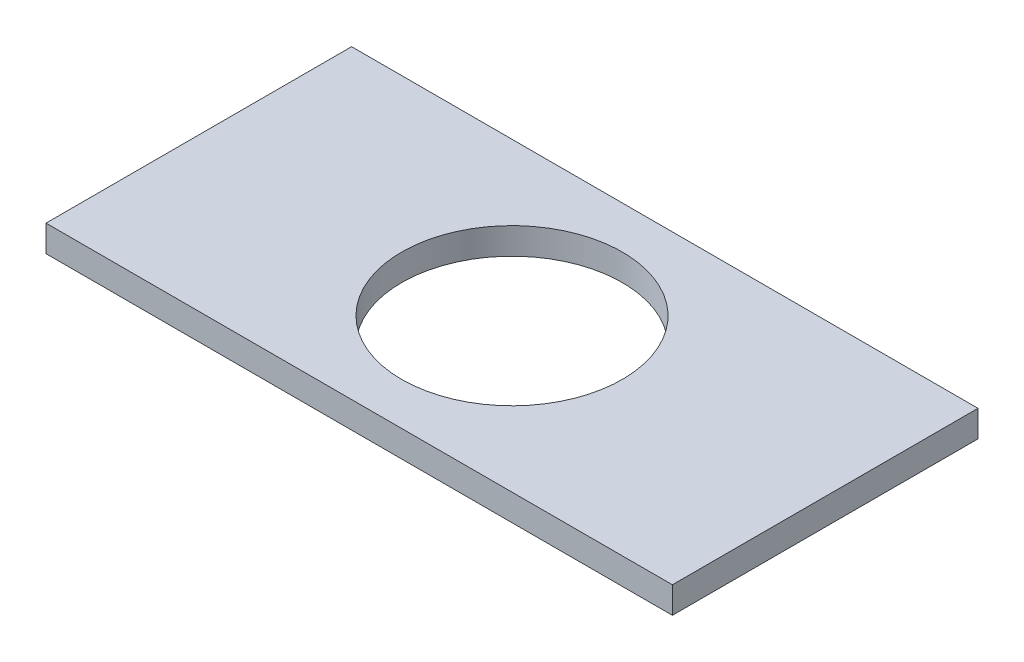
ISO-10303-21;
HEADER;
FILE_DESCRIPTION(('STEP AP214'),'2;1');
FILE_NAME('part.step','',(''),(''),'','','');
FILE_SCHEMA(('AUTOMOTIVE_DESIGN { 1 0 10303 214 1 1 1 1 }'));
ENDSEC;
DATA;
#1=APPLICATION_CONTEXT('core data for automotive mechanical design processes');
#2=APPLICATION_PROTOCOL_DEFINITION('international standard','automotive_design',2000,#1);
#3=PRODUCT_CONTEXT('',#1,'mechanical');
#4=PRODUCT('Part','Part','',(#3));
#5=PRODUCT_RELATED_PRODUCT_CATEGORY('part','',(#4));
#6=PRODUCT_DEFINITION_FORMATION('','',#4);
#7=PRODUCT_DEFINITION_CONTEXT('part definition',#1,'design');
#8=PRODUCT_DEFINITION('design','',#6,#7);
#9=PRODUCT_DEFINITION_SHAPE('','',#8);
#10=(LENGTH_UNIT() NAMED_UNIT(*) SI_UNIT(.MILLI.,.METRE.));
#11=(NAMED_UNIT(*) PLANE_ANGLE_UNIT() SI_UNIT($,.RADIAN.));
#12=(NAMED_UNIT(*) SI_UNIT($,.STERADIAN.) SOLID_ANGLE_UNIT());
#13=UNCERTAINTY_MEASURE_WITH_UNIT(LENGTH_MEASURE(1.E-05),#10,'distance_accuracy_value','');
#14=(GEOMETRIC_REPRESENTATION_CONTEXT(3) GLOBAL_UNCERTAINTY_ASSIGNED_CONTEXT((#13)) GLOBAL_UNIT_ASSIGNED_CONTEXT((#10,
#11,#12)) REPRESENTATION_CONTEXT('',''));
#15=CARTESIAN_POINT('',(0.,0.,0.));
#16=DIRECTION('',(0.,0.,1.));
#17=DIRECTION('',(1.,0.,0.));
#18=AXIS2_PLACEMENT_3D('',#15,#16,#17);
#19=CARTESIAN_POINT('',(0.,10.,0.));
#20=DIRECTION('',(0.,-1.,0.));
#21=DIRECTION('',(0.,0.,-1.));
#22=AXIS2_PLACEMENT_3D('',#19,#20,#21);
#23=PLANE('',#22);
#24=DIRECTION('',(0.,0.,-1.));
#25=VECTOR('',#24,1.);
#26=CARTESIAN_POINT('',(118.27325417391,10.,57.7052891396333));
#27=LINE('',#26,#25);
#28=CARTESIAN_POINT('',(118.27325417391,10.,57.7052891396333));
#29=VERTEX_POINT('',#28);
#30=CARTESIAN_POINT('',(118.27325417391,10.,-57.7052891396333));
#31=VERTEX_POINT('',#30);
#32=EDGE_CURVE('E92',#29,#31,#27,.T.);
#33=ORIENTED_EDGE('',*,*,#32,.T.);
#34=DIRECTION('',(-1.,0.,0.));
#35=VECTOR('',#34,1.);
#36=CARTESIAN_POINT('',(-118.27325417391,10.,-57.7052891396333));
#37=LINE('',#36,#35);
#38=CARTESIAN_POINT('',(-118.27325417391,10.,-57.7052891396333));
#39=VERTEX_POINT('',#38);
#40=EDGE_CURVE('E87',#31,#39,#37,.T.);
#41=ORIENTED_EDGE('',*,*,#40,.T.);
#42=DIRECTION('',(0.,0.,1.));
#43=VECTOR('',#42,1.);
#44=CARTESIAN_POINT('',(-118.27325417391,10.,57.7052891396333));
#45=LINE('',#44,#43);
#46=CARTESIAN_POINT('',(-118.27325417391,10.,57.7052891396333));
#47=VERTEX_POINT('',#46);
#48=EDGE_CURVE('E90',#39,#47,#45,.T.);
#49=ORIENTED_EDGE('',*,*,#48,.T.);
#50=DIRECTION('',(1.,0.,0.));
#51=VECTOR('',#50,1.);
#52=CARTESIAN_POINT('',(-118.27325417391,10.,57.7052891396333));
#53=LINE('',#52,#51);
#54=EDGE_CURVE('E57',#47,#29,#53,.T.);
#55=ORIENTED_EDGE('',*,*,#54,.T.);
#56=EDGE_LOOP('',(#33,#41,#49,#55));
#57=FACE_BOUND('',#56,.T.);
#58=CARTESIAN_POINT('',(0.,10.,0.));
#59=DIRECTION('',(0.,1.,0.));
#60=DIRECTION('',(0.,0.,1.));
#61=AXIS2_PLACEMENT_3D('',#58,#59,#60);
#62=CIRCLE('',#61,41.672667567214);
#63=CARTESIAN_POINT('',(0.,10.,41.672667567214));
#64=VERTEX_POINT('',#63);
#65=EDGE_CURVE('E112',#64,#64,#62,.T.);
#66=ORIENTED_EDGE('',*,*,#65,.F.);
#67=EDGE_LOOP('',(#66));
#68=FACE_BOUND('',#67,.T.);
#69=ADVANCED_FACE('F39',(#57,#68),#23,.F.);
#70=CARTESIAN_POINT('',(0.,0.,0.));
#71=DIRECTION('',(0.,-1.,0.));
#72=DIRECTION('',(0.,0.,-1.));
#73=AXIS2_PLACEMENT_3D('',#70,#71,#72);
#74=PLANE('',#73);
#75=DIRECTION('',(0.,0.,-1.));
#76=VECTOR('',#75,1.);
#77=CARTESIAN_POINT('',(118.27325417391,0.,57.7052891396333));
#78=LINE('',#77,#76);
#79=CARTESIAN_POINT('',(118.27325417391,0.,57.7052891396333));
#80=VERTEX_POINT('',#79);
#81=CARTESIAN_POINT('',(118.27325417391,0.,-57.7052891396333));
#82=VERTEX_POINT('',#81);
#83=EDGE_CURVE('E108',#80,#82,#78,.T.);
#84=ORIENTED_EDGE('',*,*,#83,.F.);
#85=DIRECTION('',(1.,0.,0.));
#86=VECTOR('',#85,1.);
#87=CARTESIAN_POINT('',(-118.27325417391,0.,57.7052891396333));
#88=LINE('',#87,#86);
#89=CARTESIAN_POINT('',(-118.27325417391,0.,57.7052891396333));
#90=VERTEX_POINT('',#89);
#91=EDGE_CURVE('E80',#90,#80,#88,.T.);
#92=ORIENTED_EDGE('',*,*,#91,.F.);
#93=DIRECTION('',(0.,0.,1.));
#94=VECTOR('',#93,1.);
#95=CARTESIAN_POINT('',(-118.27325417391,0.,57.7052891396333));
#96=LINE('',#95,#94);
#97=CARTESIAN_POINT('',(-118.27325417391,0.,-57.7052891396333));
#98=VERTEX_POINT('',#97);
#99=EDGE_CURVE('E74',#98,#90,#96,.T.);
#100=ORIENTED_EDGE('',*,*,#99,.F.);
#101=DIRECTION('',(-1.,0.,0.));
#102=VECTOR('',#101,1.);
#103=CARTESIAN_POINT('',(-118.27325417391,0.,-57.7052891396333));
#104=LINE('',#103,#102);
#105=EDGE_CURVE('E97',#82,#98,#104,.T.);
#106=ORIENTED_EDGE('',*,*,#105,.F.);
#107=EDGE_LOOP('',(#84,#92,#100,#106));
#108=FACE_BOUND('',#107,.T.);
#109=CARTESIAN_POINT('',(0.,0.,0.));
#110=DIRECTION('',(0.,1.,0.));
#111=DIRECTION('',(0.,0.,1.));
#112=AXIS2_PLACEMENT_3D('',#109,#110,#111);
#113=CIRCLE('',#112,41.672667567214);
#114=CARTESIAN_POINT('',(0.,0.,41.672667567214));
#115=VERTEX_POINT('',#114);
#116=EDGE_CURVE('E130',#115,#115,#113,.T.);
#117=ORIENTED_EDGE('',*,*,#116,.T.);
#118=EDGE_LOOP('',(#117));
#119=FACE_BOUND('',#118,.T.);
#120=ADVANCED_FACE('F125',(#108,#119),#74,.T.);
#121=CARTESIAN_POINT('',(118.27325417391,10.,57.7052891396333));
#122=DIRECTION('',(-1.,0.,0.));
#123=DIRECTION('',(0.,0.,1.));
#124=AXIS2_PLACEMENT_3D('',#121,#122,#123);
#125=PLANE('',#124);
#126=ORIENTED_EDGE('',*,*,#83,.T.);
#127=DIRECTION('',(0.,-1.,0.));
#128=VECTOR('',#127,1.);
#129=CARTESIAN_POINT('',(118.27325417391,10.,-57.7052891396333));
#130=LINE('',#129,#128);
#131=EDGE_CURVE('E11',#31,#82,#130,.T.);
#132=ORIENTED_EDGE('',*,*,#131,.F.);
#133=ORIENTED_EDGE('',*,*,#32,.F.);
#134=DIRECTION('',(0.,-1.,0.));
#135=VECTOR('',#134,1.);
#136=CARTESIAN_POINT('',(118.27325417391,10.,57.7052891396333));
#137=LINE('',#136,#135);
#138=EDGE_CURVE('E104',#29,#80,#137,.T.);
#139=ORIENTED_EDGE('',*,*,#138,.T.);
#140=EDGE_LOOP('',(#126,#132,#133,#139));
#141=FACE_BOUND('',#140,.T.);
#142=ADVANCED_FACE('F41',(#141),#125,.F.);
#143=CARTESIAN_POINT('',(-118.27325417391,10.,-57.7052891396333));
#144=DIRECTION('',(0.,0.,1.));
#145=DIRECTION('',(1.,0.,0.));
#146=AXIS2_PLACEMENT_3D('',#143,#144,#145);
#147=PLANE('',#146);
#148=ORIENTED_EDGE('',*,*,#105,.T.);
#149=DIRECTION('',(0.,-1.,0.));
#150=VECTOR('',#149,1.);
#151=CARTESIAN_POINT('',(-118.27325417391,10.,-57.7052891396333));
#152=LINE('',#151,#150);
#153=EDGE_CURVE('E49',#39,#98,#152,.T.);
#154=ORIENTED_EDGE('',*,*,#153,.F.);
#155=ORIENTED_EDGE('',*,*,#40,.F.);
#156=ORIENTED_EDGE('',*,*,#131,.T.);
#157=EDGE_LOOP('',(#148,#154,#155,#156));
#158=FACE_BOUND('',#157,.T.);
#159=ADVANCED_FACE('F96',(#158),#147,.F.);
#160=CARTESIAN_POINT('',(-118.27325417391,10.,57.7052891396333));
#161=DIRECTION('',(1.,0.,0.));
#162=DIRECTION('',(0.,0.,-1.));
#163=AXIS2_PLACEMENT_3D('',#160,#161,#162);
#164=PLANE('',#163);
#165=ORIENTED_EDGE('',*,*,#99,.T.);
#166=DIRECTION('',(0.,-1.,0.));
#167=VECTOR('',#166,1.);
#168=CARTESIAN_POINT('',(-118.27325417391,10.,57.7052891396333));
#169=LINE('',#168,#167);
#170=EDGE_CURVE('E99',#47,#90,#169,.T.);
#171=ORIENTED_EDGE('',*,*,#170,.F.);
#172=ORIENTED_EDGE('',*,*,#48,.F.);
#173=ORIENTED_EDGE('',*,*,#153,.T.);
#174=EDGE_LOOP('',(#165,#171,#172,#173));
#175=FACE_BOUND('',#174,.T.);
#176=ADVANCED_FACE('F100',(#175),#164,.F.);
#177=CARTESIAN_POINT('',(-118.27325417391,10.,57.7052891396333));
#178=DIRECTION('',(0.,0.,-1.));
#179=DIRECTION('',(-1.,0.,0.));
#180=AXIS2_PLACEMENT_3D('',#177,#178,#179);
#181=PLANE('',#180);
#182=ORIENTED_EDGE('',*,*,#91,.T.);
#183=ORIENTED_EDGE('',*,*,#138,.F.);
#184=ORIENTED_EDGE('',*,*,#54,.F.);
#185=ORIENTED_EDGE('',*,*,#170,.T.);
#186=EDGE_LOOP('',(#182,#183,#184,#185));
#187=FACE_BOUND('',#186,.T.);
#188=ADVANCED_FACE('F122',(#187),#181,.F.);
#189=CARTESIAN_POINT('',(0.,10.,0.));
#190=DIRECTION('',(0.,-1.,0.));
#191=DIRECTION('',(0.,0.,-1.));
#192=AXIS2_PLACEMENT_3D('',#189,#190,#191);
#193=CYLINDRICAL_SURFACE('',#192,41.672667567214);
#194=ORIENTED_EDGE('',*,*,#65,.T.);
#195=EDGE_LOOP('',(#194));
#196=FACE_BOUND('',#195,.T.);
#197=ORIENTED_EDGE('',*,*,#116,.F.);
#198=EDGE_LOOP('',(#197));
#199=FACE_BOUND('',#198,.T.);
#200=ADVANCED_FACE('F138',(#196,#199),#193,.F.);
#201=CLOSED_SHELL('',(#69,#120,#142,#159,#176,#188,#200));
#202=MANIFOLD_SOLID_BREP('B2',#201);
#203=ADVANCED_BREP_SHAPE_REPRESENTATION('',(#18,#202),#14);
#204=SHAPE_DEFINITION_REPRESENTATION(#9,#203);
ENDSEC;
END-ISO-10303-21;
